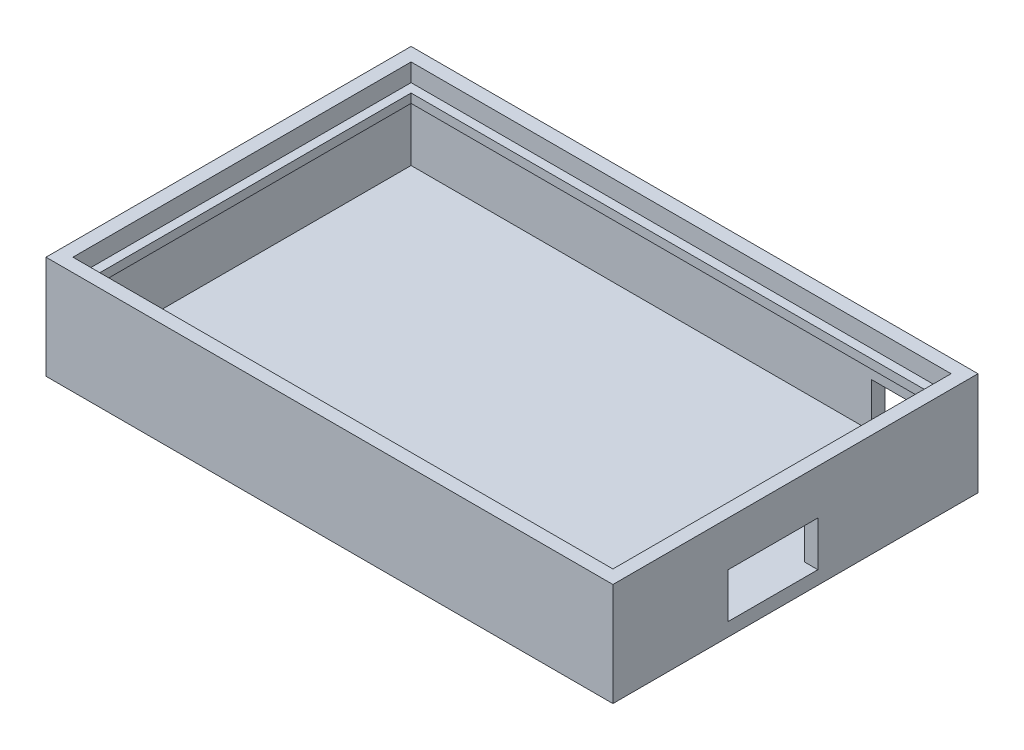
ISO-10303-21;
HEADER;
FILE_DESCRIPTION(('STEP AP214'),'2;1');
FILE_NAME('part.step','',(''),(''),'','','');
FILE_SCHEMA(('AUTOMOTIVE_DESIGN { 1 0 10303 214 1 1 1 1 }'));
ENDSEC;
DATA;
#1=APPLICATION_CONTEXT('core data for automotive mechanical design processes');
#2=APPLICATION_PROTOCOL_DEFINITION('international standard','automotive_design',2000,#1);
#3=PRODUCT_CONTEXT('',#1,'mechanical');
#4=PRODUCT('Part','Part','',(#3));
#5=PRODUCT_RELATED_PRODUCT_CATEGORY('part','',(#4));
#6=PRODUCT_DEFINITION_FORMATION('','',#4);
#7=PRODUCT_DEFINITION_CONTEXT('part definition',#1,'design');
#8=PRODUCT_DEFINITION('design','',#6,#7);
#9=PRODUCT_DEFINITION_SHAPE('','',#8);
#10=(LENGTH_UNIT() NAMED_UNIT(*) SI_UNIT(.MILLI.,.METRE.));
#11=(NAMED_UNIT(*) PLANE_ANGLE_UNIT() SI_UNIT($,.RADIAN.));
#12=(NAMED_UNIT(*) SI_UNIT($,.STERADIAN.) SOLID_ANGLE_UNIT());
#13=UNCERTAINTY_MEASURE_WITH_UNIT(LENGTH_MEASURE(1.E-05),#10,'distance_accuracy_value','');
#14=(GEOMETRIC_REPRESENTATION_CONTEXT(3) GLOBAL_UNCERTAINTY_ASSIGNED_CONTEXT((#13)) GLOBAL_UNIT_ASSIGNED_CONTEXT((#10,
#11,#12)) REPRESENTATION_CONTEXT('',''));
#15=CARTESIAN_POINT('',(0.,0.,0.));
#16=DIRECTION('',(0.,0.,1.));
#17=DIRECTION('',(1.,0.,0.));
#18=AXIS2_PLACEMENT_3D('',#15,#16,#17);
#19=CARTESIAN_POINT('',(-60.2,23.,-37.7));
#20=DIRECTION('',(0.,0.,1.));
#21=DIRECTION('',(1.,0.,0.));
#22=AXIS2_PLACEMENT_3D('',#19,#20,#21);
#23=PLANE('',#22);
#24=DIRECTION('',(0.,-1.,0.));
#25=VECTOR('',#24,1.);
#26=CARTESIAN_POINT('',(60.2,23.,-37.7));
#27=LINE('',#26,#25);
#28=CARTESIAN_POINT('',(60.2,15.,-37.7));
#29=VERTEX_POINT('',#28);
#30=CARTESIAN_POINT('',(60.2,3.,-37.7));
#31=VERTEX_POINT('',#30);
#32=EDGE_CURVE('E349',#29,#31,#27,.T.);
#33=ORIENTED_EDGE('',*,*,#32,.F.);
#34=DIRECTION('',(-1.,0.,0.));
#35=VECTOR('',#34,1.);
#36=CARTESIAN_POINT('',(-60.2,15.,-37.7));
#37=LINE('',#36,#35);
#38=CARTESIAN_POINT('',(-60.2,15.,-37.7));
#39=VERTEX_POINT('',#38);
#40=EDGE_CURVE('E44',#29,#39,#37,.T.);
#41=ORIENTED_EDGE('',*,*,#40,.T.);
#42=DIRECTION('',(0.,-1.,0.));
#43=VECTOR('',#42,1.);
#44=CARTESIAN_POINT('',(-60.2,23.,-37.7));
#45=LINE('',#44,#43);
#46=CARTESIAN_POINT('',(-60.2,3.,-37.7));
#47=VERTEX_POINT('',#46);
#48=EDGE_CURVE('E345',#39,#47,#45,.T.);
#49=ORIENTED_EDGE('',*,*,#48,.T.);
#50=DIRECTION('',(-1.,0.,0.));
#51=VECTOR('',#50,1.);
#52=CARTESIAN_POINT('',(-60.2,3.,-37.7));
#53=LINE('',#52,#51);
#54=CARTESIAN_POINT('',(42.5,3.,-37.7));
#55=VERTEX_POINT('',#54);
#56=EDGE_CURVE('E337',#55,#47,#53,.T.);
#57=ORIENTED_EDGE('',*,*,#56,.F.);
#58=DIRECTION('',(0.,1.,0.));
#59=VECTOR('',#58,1.);
#60=CARTESIAN_POINT('',(42.5,23.,-37.7));
#61=LINE('',#60,#59);
#62=CARTESIAN_POINT('',(42.5,13.,-37.7));
#63=VERTEX_POINT('',#62);
#64=EDGE_CURVE('E273',#55,#63,#61,.T.);
#65=ORIENTED_EDGE('',*,*,#64,.T.);
#66=DIRECTION('',(1.,0.,0.));
#67=VECTOR('',#66,1.);
#68=CARTESIAN_POINT('',(-60.2,13.,-37.7));
#69=LINE('',#68,#67);
#70=CARTESIAN_POINT('',(57.5,13.,-37.7));
#71=VERTEX_POINT('',#70);
#72=EDGE_CURVE('E391',#63,#71,#69,.T.);
#73=ORIENTED_EDGE('',*,*,#72,.T.);
#74=DIRECTION('',(0.,-1.,0.));
#75=VECTOR('',#74,1.);
#76=CARTESIAN_POINT('',(57.5,23.,-37.7));
#77=LINE('',#76,#75);
#78=CARTESIAN_POINT('',(57.5,3.,-37.7));
#79=VERTEX_POINT('',#78);
#80=EDGE_CURVE('E281',#71,#79,#77,.T.);
#81=ORIENTED_EDGE('',*,*,#80,.T.);
#82=EDGE_CURVE('E338',#31,#79,#53,.T.);
#83=ORIENTED_EDGE('',*,*,#82,.F.);
#84=EDGE_LOOP('',(#33,#41,#49,#57,#65,#73,#81,#83));
#85=FACE_BOUND('',#84,.T.);
#86=ADVANCED_FACE('F35',(#85),#23,.T.);
#87=CARTESIAN_POINT('',(60.2,23.,37.7));
#88=DIRECTION('',(-1.,0.,0.));
#89=DIRECTION('',(0.,0.,1.));
#90=AXIS2_PLACEMENT_3D('',#87,#88,#89);
#91=PLANE('',#90);
#92=DIRECTION('',(0.,-1.,0.));
#93=VECTOR('',#92,1.);
#94=CARTESIAN_POINT('',(60.2,23.,37.7));
#95=LINE('',#94,#93);
#96=CARTESIAN_POINT('',(60.2,15.,37.7));
#97=VERTEX_POINT('',#96);
#98=CARTESIAN_POINT('',(60.2,3.,37.7));
#99=VERTEX_POINT('',#98);
#100=EDGE_CURVE('E353',#97,#99,#95,.T.);
#101=ORIENTED_EDGE('',*,*,#100,.F.);
#102=DIRECTION('',(0.,0.,-1.));
#103=VECTOR('',#102,1.);
#104=CARTESIAN_POINT('',(60.2,15.,37.7));
#105=LINE('',#104,#103);
#106=EDGE_CURVE('E59',#97,#29,#105,.T.);
#107=ORIENTED_EDGE('',*,*,#106,.T.);
#108=ORIENTED_EDGE('',*,*,#32,.T.);
#109=DIRECTION('',(0.,0.,-1.));
#110=VECTOR('',#109,1.);
#111=CARTESIAN_POINT('',(60.2,3.,37.7));
#112=LINE('',#111,#110);
#113=CARTESIAN_POINT('',(60.2,3.,-5.));
#114=VERTEX_POINT('',#113);
#115=EDGE_CURVE('E333',#114,#31,#112,.T.);
#116=ORIENTED_EDGE('',*,*,#115,.F.);
#117=DIRECTION('',(0.,1.,0.));
#118=VECTOR('',#117,1.);
#119=CARTESIAN_POINT('',(60.2,23.,-5.));
#120=LINE('',#119,#118);
#121=CARTESIAN_POINT('',(60.2,13.,-5.));
#122=VERTEX_POINT('',#121);
#123=EDGE_CURVE('E316',#114,#122,#120,.T.);
#124=ORIENTED_EDGE('',*,*,#123,.T.);
#125=DIRECTION('',(0.,0.,-1.));
#126=VECTOR('',#125,1.);
#127=CARTESIAN_POINT('',(60.2,13.,37.7));
#128=LINE('',#127,#126);
#129=CARTESIAN_POINT('',(60.2,13.,15.));
#130=VERTEX_POINT('',#129);
#131=EDGE_CURVE('E389',#130,#122,#128,.T.);
#132=ORIENTED_EDGE('',*,*,#131,.F.);
#133=DIRECTION('',(0.,-1.,0.));
#134=VECTOR('',#133,1.);
#135=CARTESIAN_POINT('',(60.2,23.,15.));
#136=LINE('',#135,#134);
#137=CARTESIAN_POINT('',(60.2,3.,15.));
#138=VERTEX_POINT('',#137);
#139=EDGE_CURVE('E313',#130,#138,#136,.T.);
#140=ORIENTED_EDGE('',*,*,#139,.T.);
#141=EDGE_CURVE('E334',#99,#138,#112,.T.);
#142=ORIENTED_EDGE('',*,*,#141,.F.);
#143=EDGE_LOOP('',(#101,#107,#108,#116,#124,#132,#140,#142));
#144=FACE_BOUND('',#143,.T.);
#145=ADVANCED_FACE('F414',(#144),#91,.T.);
#146=CARTESIAN_POINT('',(-60.2,23.,37.7));
#147=DIRECTION('',(0.,0.,-1.));
#148=DIRECTION('',(-1.,0.,0.));
#149=AXIS2_PLACEMENT_3D('',#146,#147,#148);
#150=PLANE('',#149);
#151=DIRECTION('',(0.,-1.,0.));
#152=VECTOR('',#151,1.);
#153=CARTESIAN_POINT('',(-60.2,23.,37.7));
#154=LINE('',#153,#152);
#155=CARTESIAN_POINT('',(-60.2,15.,37.7));
#156=VERTEX_POINT('',#155);
#157=CARTESIAN_POINT('',(-60.2,3.,37.7));
#158=VERTEX_POINT('',#157);
#159=EDGE_CURVE('E330',#156,#158,#154,.T.);
#160=ORIENTED_EDGE('',*,*,#159,.F.);
#161=DIRECTION('',(1.,0.,0.));
#162=VECTOR('',#161,1.);
#163=CARTESIAN_POINT('',(-60.2,15.,37.7));
#164=LINE('',#163,#162);
#165=EDGE_CURVE('E205',#156,#97,#164,.T.);
#166=ORIENTED_EDGE('',*,*,#165,.T.);
#167=ORIENTED_EDGE('',*,*,#100,.T.);
#168=DIRECTION('',(1.,0.,0.));
#169=VECTOR('',#168,1.);
#170=CARTESIAN_POINT('',(-60.2,3.,37.7));
#171=LINE('',#170,#169);
#172=EDGE_CURVE('E319',#158,#99,#171,.T.);
#173=ORIENTED_EDGE('',*,*,#172,.F.);
#174=EDGE_LOOP('',(#160,#166,#167,#173));
#175=FACE_BOUND('',#174,.T.);
#176=ADVANCED_FACE('F409',(#175),#150,.T.);
#177=CARTESIAN_POINT('',(-60.2,23.,37.7));
#178=DIRECTION('',(1.,0.,0.));
#179=DIRECTION('',(0.,0.,-1.));
#180=AXIS2_PLACEMENT_3D('',#177,#178,#179);
#181=PLANE('',#180);
#182=ORIENTED_EDGE('',*,*,#48,.F.);
#183=DIRECTION('',(0.,0.,1.));
#184=VECTOR('',#183,1.);
#185=CARTESIAN_POINT('',(-60.2,15.,37.7));
#186=LINE('',#185,#184);
#187=EDGE_CURVE('E11',#39,#156,#186,.T.);
#188=ORIENTED_EDGE('',*,*,#187,.T.);
#189=ORIENTED_EDGE('',*,*,#159,.T.);
#190=DIRECTION('',(0.,0.,1.));
#191=VECTOR('',#190,1.);
#192=CARTESIAN_POINT('',(-60.2,3.,37.7));
#193=LINE('',#192,#191);
#194=EDGE_CURVE('E323',#47,#158,#193,.T.);
#195=ORIENTED_EDGE('',*,*,#194,.F.);
#196=EDGE_LOOP('',(#182,#188,#189,#195));
#197=FACE_BOUND('',#196,.T.);
#198=ADVANCED_FACE('F405',(#197),#181,.T.);
#199=CARTESIAN_POINT('',(0.,3.,-40.7));
#200=DIRECTION('',(0.,0.,-1.));
#201=DIRECTION('',(-1.,0.,0.));
#202=AXIS2_PLACEMENT_3D('',#199,#200,#201);
#203=PLANE('',#202);
#204=DIRECTION('',(1.,0.,0.));
#205=VECTOR('',#204,1.);
#206=CARTESIAN_POINT('',(0.,0.,-40.7));
#207=LINE('',#206,#205);
#208=CARTESIAN_POINT('',(-63.2,0.,-40.7));
#209=VERTEX_POINT('',#208);
#210=CARTESIAN_POINT('',(63.2,0.,-40.7));
#211=VERTEX_POINT('',#210);
#212=EDGE_CURVE('E377',#209,#211,#207,.T.);
#213=ORIENTED_EDGE('',*,*,#212,.F.);
#214=DIRECTION('',(0.,-1.,0.));
#215=VECTOR('',#214,1.);
#216=CARTESIAN_POINT('',(-63.2,3.,-40.7));
#217=LINE('',#216,#215);
#218=CARTESIAN_POINT('',(-63.2,23.,-40.7));
#219=VERTEX_POINT('',#218);
#220=EDGE_CURVE('E380',#219,#209,#217,.T.);
#221=ORIENTED_EDGE('',*,*,#220,.F.);
#222=DIRECTION('',(-1.,0.,0.));
#223=VECTOR('',#222,1.);
#224=CARTESIAN_POINT('',(-63.2,23.,-40.7));
#225=LINE('',#224,#223);
#226=CARTESIAN_POINT('',(63.2,23.,-40.7));
#227=VERTEX_POINT('',#226);
#228=EDGE_CURVE('E363',#227,#219,#225,.T.);
#229=ORIENTED_EDGE('',*,*,#228,.F.);
#230=DIRECTION('',(0.,-1.,0.));
#231=VECTOR('',#230,1.);
#232=CARTESIAN_POINT('',(63.2,3.,-40.7));
#233=LINE('',#232,#231);
#234=EDGE_CURVE('E382',#227,#211,#233,.T.);
#235=ORIENTED_EDGE('',*,*,#234,.T.);
#236=EDGE_LOOP('',(#213,#221,#229,#235));
#237=FACE_BOUND('',#236,.T.);
#238=DIRECTION('',(0.,1.,0.));
#239=VECTOR('',#238,1.);
#240=CARTESIAN_POINT('',(57.5,3.,-40.7));
#241=LINE('',#240,#239);
#242=CARTESIAN_POINT('',(57.5,3.,-40.7));
#243=VERTEX_POINT('',#242);
#244=CARTESIAN_POINT('',(57.5,13.,-40.7));
#245=VERTEX_POINT('',#244);
#246=EDGE_CURVE('E284',#243,#245,#241,.T.);
#247=ORIENTED_EDGE('',*,*,#246,.T.);
#248=DIRECTION('',(-1.,0.,0.));
#249=VECTOR('',#248,1.);
#250=CARTESIAN_POINT('',(0.,13.,-40.7));
#251=LINE('',#250,#249);
#252=CARTESIAN_POINT('',(42.5,13.,-40.7));
#253=VERTEX_POINT('',#252);
#254=EDGE_CURVE('E289',#245,#253,#251,.T.);
#255=ORIENTED_EDGE('',*,*,#254,.T.);
#256=DIRECTION('',(0.,-1.,0.));
#257=VECTOR('',#256,1.);
#258=CARTESIAN_POINT('',(42.5,3.,-40.7));
#259=LINE('',#258,#257);
#260=CARTESIAN_POINT('',(42.5,3.,-40.7));
#261=VERTEX_POINT('',#260);
#262=EDGE_CURVE('E278',#253,#261,#259,.T.);
#263=ORIENTED_EDGE('',*,*,#262,.T.);
#264=DIRECTION('',(-1.,0.,0.));
#265=VECTOR('',#264,1.);
#266=CARTESIAN_POINT('',(0.,3.,-40.7));
#267=LINE('',#266,#265);
#268=EDGE_CURVE('E287',#243,#261,#267,.T.);
#269=ORIENTED_EDGE('',*,*,#268,.F.);
#270=EDGE_LOOP('',(#247,#255,#263,#269));
#271=FACE_BOUND('',#270,.T.);
#272=ADVANCED_FACE('F442',(#237,#271),#203,.T.);
#273=DIRECTION('',(-1.,0.,0.));
#274=VECTOR('',#273,1.);
#275=CARTESIAN_POINT('',(60.2,19.,-37.7));
#276=LINE('',#275,#274);
#277=CARTESIAN_POINT('',(60.2,19.,-37.7));
#278=VERTEX_POINT('',#277);
#279=CARTESIAN_POINT('',(-60.2,19.,-37.7));
#280=VERTEX_POINT('',#279);
#281=EDGE_CURVE('E259',#278,#280,#276,.T.);
#282=ORIENTED_EDGE('',*,*,#281,.F.);
#283=CARTESIAN_POINT('',(60.2,23.,-37.7));
#284=VERTEX_POINT('',#283);
#285=EDGE_CURVE('E350',#284,#278,#27,.T.);
#286=ORIENTED_EDGE('',*,*,#285,.F.);
#287=DIRECTION('',(-1.,0.,0.));
#288=VECTOR('',#287,1.);
#289=CARTESIAN_POINT('',(-60.2,23.,-37.7));
#290=LINE('',#289,#288);
#291=CARTESIAN_POINT('',(-60.2,23.,-37.7));
#292=VERTEX_POINT('',#291);
#293=EDGE_CURVE('E325',#284,#292,#290,.T.);
#294=ORIENTED_EDGE('',*,*,#293,.T.);
#295=EDGE_CURVE('E346',#292,#280,#45,.T.);
#296=ORIENTED_EDGE('',*,*,#295,.T.);
#297=EDGE_LOOP('',(#282,#286,#294,#296));
#298=FACE_BOUND('',#297,.T.);
#299=ADVANCED_FACE('F460',(#298),#23,.T.);
#300=DIRECTION('',(0.,0.,-1.));
#301=VECTOR('',#300,1.);
#302=CARTESIAN_POINT('',(60.2,19.,37.7));
#303=LINE('',#302,#301);
#304=CARTESIAN_POINT('',(60.2,19.,37.7));
#305=VERTEX_POINT('',#304);
#306=EDGE_CURVE('E256',#305,#278,#303,.T.);
#307=ORIENTED_EDGE('',*,*,#306,.F.);
#308=CARTESIAN_POINT('',(60.2,23.,37.7));
#309=VERTEX_POINT('',#308);
#310=EDGE_CURVE('E354',#309,#305,#95,.T.);
#311=ORIENTED_EDGE('',*,*,#310,.F.);
#312=DIRECTION('',(0.,0.,-1.));
#313=VECTOR('',#312,1.);
#314=CARTESIAN_POINT('',(60.2,23.,37.7));
#315=LINE('',#314,#313);
#316=EDGE_CURVE('E322',#309,#284,#315,.T.);
#317=ORIENTED_EDGE('',*,*,#316,.T.);
#318=ORIENTED_EDGE('',*,*,#285,.T.);
#319=EDGE_LOOP('',(#307,#311,#317,#318));
#320=FACE_BOUND('',#319,.T.);
#321=ADVANCED_FACE('F466',(#320),#91,.T.);
#322=CARTESIAN_POINT('',(-63.2,3.,0.));
#323=DIRECTION('',(-1.,0.,0.));
#324=DIRECTION('',(0.,0.,1.));
#325=AXIS2_PLACEMENT_3D('',#322,#323,#324);
#326=PLANE('',#325);
#327=DIRECTION('',(0.,0.,-1.));
#328=VECTOR('',#327,1.);
#329=CARTESIAN_POINT('',(-63.2,0.,0.));
#330=LINE('',#329,#328);
#331=CARTESIAN_POINT('',(-63.2,0.,40.7));
#332=VERTEX_POINT('',#331);
#333=EDGE_CURVE('E369',#332,#209,#330,.T.);
#334=ORIENTED_EDGE('',*,*,#333,.F.);
#335=DIRECTION('',(0.,-1.,0.));
#336=VECTOR('',#335,1.);
#337=CARTESIAN_POINT('',(-63.2,3.,40.7));
#338=LINE('',#337,#336);
#339=CARTESIAN_POINT('',(-63.2,23.,40.7));
#340=VERTEX_POINT('',#339);
#341=EDGE_CURVE('E387',#340,#332,#338,.T.);
#342=ORIENTED_EDGE('',*,*,#341,.F.);
#343=DIRECTION('',(0.,0.,1.));
#344=VECTOR('',#343,1.);
#345=CARTESIAN_POINT('',(-63.2,23.,40.7));
#346=LINE('',#345,#344);
#347=EDGE_CURVE('E366',#219,#340,#346,.T.);
#348=ORIENTED_EDGE('',*,*,#347,.F.);
#349=ORIENTED_EDGE('',*,*,#220,.T.);
#350=EDGE_LOOP('',(#334,#342,#348,#349));
#351=FACE_BOUND('',#350,.T.);
#352=ADVANCED_FACE('F474',(#351),#326,.T.);
#353=CARTESIAN_POINT('',(0.,3.,40.7));
#354=DIRECTION('',(0.,0.,-1.));
#355=DIRECTION('',(-1.,0.,0.));
#356=AXIS2_PLACEMENT_3D('',#353,#354,#355);
#357=PLANE('',#356);
#358=DIRECTION('',(1.,0.,0.));
#359=VECTOR('',#358,1.);
#360=CARTESIAN_POINT('',(0.,0.,40.7));
#361=LINE('',#360,#359);
#362=CARTESIAN_POINT('',(63.2,0.,40.7));
#363=VERTEX_POINT('',#362);
#364=EDGE_CURVE('E372',#332,#363,#361,.T.);
#365=ORIENTED_EDGE('',*,*,#364,.T.);
#366=DIRECTION('',(0.,-1.,0.));
#367=VECTOR('',#366,1.);
#368=CARTESIAN_POINT('',(63.2,3.,40.7));
#369=LINE('',#368,#367);
#370=CARTESIAN_POINT('',(63.2,23.,40.7));
#371=VERTEX_POINT('',#370);
#372=EDGE_CURVE('E384',#371,#363,#369,.T.);
#373=ORIENTED_EDGE('',*,*,#372,.F.);
#374=DIRECTION('',(1.,0.,0.));
#375=VECTOR('',#374,1.);
#376=CARTESIAN_POINT('',(-63.2,23.,40.7));
#377=LINE('',#376,#375);
#378=EDGE_CURVE('E357',#340,#371,#377,.T.);
#379=ORIENTED_EDGE('',*,*,#378,.F.);
#380=ORIENTED_EDGE('',*,*,#341,.T.);
#381=EDGE_LOOP('',(#365,#373,#379,#380));
#382=FACE_BOUND('',#381,.T.);
#383=ADVANCED_FACE('F519',(#382),#357,.F.);
#384=CARTESIAN_POINT('',(63.2,3.,0.));
#385=DIRECTION('',(-1.,0.,0.));
#386=DIRECTION('',(0.,0.,1.));
#387=AXIS2_PLACEMENT_3D('',#384,#385,#386);
#388=PLANE('',#387);
#389=DIRECTION('',(0.,-1.,0.));
#390=VECTOR('',#389,1.);
#391=CARTESIAN_POINT('',(63.2,13.,15.));
#392=LINE('',#391,#390);
#393=CARTESIAN_POINT('',(63.2,13.,15.));
#394=VERTEX_POINT('',#393);
#395=CARTESIAN_POINT('',(63.2,3.,15.));
#396=VERTEX_POINT('',#395);
#397=EDGE_CURVE('E302',#394,#396,#392,.T.);
#398=ORIENTED_EDGE('',*,*,#397,.F.);
#399=DIRECTION('',(0.,0.,-1.));
#400=VECTOR('',#399,1.);
#401=CARTESIAN_POINT('',(63.2,13.,15.));
#402=LINE('',#401,#400);
#403=CARTESIAN_POINT('',(63.2,13.,-5.));
#404=VERTEX_POINT('',#403);
#405=EDGE_CURVE('E293',#394,#404,#402,.T.);
#406=ORIENTED_EDGE('',*,*,#405,.T.);
#407=DIRECTION('',(0.,-1.,0.));
#408=VECTOR('',#407,1.);
#409=CARTESIAN_POINT('',(63.2,13.,-5.));
#410=LINE('',#409,#408);
#411=CARTESIAN_POINT('',(63.2,3.,-5.));
#412=VERTEX_POINT('',#411);
#413=EDGE_CURVE('E310',#404,#412,#410,.T.);
#414=ORIENTED_EDGE('',*,*,#413,.T.);
#415=DIRECTION('',(0.,0.,-1.));
#416=VECTOR('',#415,1.);
#417=CARTESIAN_POINT('',(63.2,3.,15.));
#418=LINE('',#417,#416);
#419=EDGE_CURVE('E292',#396,#412,#418,.T.);
#420=ORIENTED_EDGE('',*,*,#419,.F.);
#421=EDGE_LOOP('',(#398,#406,#414,#420));
#422=FACE_BOUND('',#421,.T.);
#423=DIRECTION('',(0.,0.,-1.));
#424=VECTOR('',#423,1.);
#425=CARTESIAN_POINT('',(63.2,0.,0.));
#426=LINE('',#425,#424);
#427=EDGE_CURVE('E374',#363,#211,#426,.T.);
#428=ORIENTED_EDGE('',*,*,#427,.T.);
#429=ORIENTED_EDGE('',*,*,#234,.F.);
#430=DIRECTION('',(0.,0.,-1.));
#431=VECTOR('',#430,1.);
#432=CARTESIAN_POINT('',(63.2,23.,40.7));
#433=LINE('',#432,#431);
#434=EDGE_CURVE('E360',#371,#227,#433,.T.);
#435=ORIENTED_EDGE('',*,*,#434,.F.);
#436=ORIENTED_EDGE('',*,*,#372,.T.);
#437=EDGE_LOOP('',(#428,#429,#435,#436));
#438=FACE_BOUND('',#437,.T.);
#439=ADVANCED_FACE('F426',(#422,#438),#388,.F.);
#440=CARTESIAN_POINT('',(0.,0.,0.));
#441=DIRECTION('',(0.,1.,0.));
#442=DIRECTION('',(0.,0.,1.));
#443=AXIS2_PLACEMENT_3D('',#440,#441,#442);
#444=PLANE('',#443);
#445=ORIENTED_EDGE('',*,*,#333,.T.);
#446=ORIENTED_EDGE('',*,*,#212,.T.);
#447=ORIENTED_EDGE('',*,*,#427,.F.);
#448=ORIENTED_EDGE('',*,*,#364,.F.);
#449=EDGE_LOOP('',(#445,#446,#447,#448));
#450=FACE_BOUND('',#449,.T.);
#451=ADVANCED_FACE('F511',(#450),#444,.F.);
#452=CARTESIAN_POINT('',(0.,23.,0.));
#453=DIRECTION('',(0.,1.,0.));
#454=DIRECTION('',(0.,0.,1.));
#455=AXIS2_PLACEMENT_3D('',#452,#453,#454);
#456=PLANE('',#455);
#457=ORIENTED_EDGE('',*,*,#378,.T.);
#458=ORIENTED_EDGE('',*,*,#434,.T.);
#459=ORIENTED_EDGE('',*,*,#228,.T.);
#460=ORIENTED_EDGE('',*,*,#347,.T.);
#461=EDGE_LOOP('',(#457,#458,#459,#460));
#462=FACE_BOUND('',#461,.T.);
#463=ORIENTED_EDGE('',*,*,#316,.F.);
#464=DIRECTION('',(1.,0.,0.));
#465=VECTOR('',#464,1.);
#466=CARTESIAN_POINT('',(-60.2,23.,37.7));
#467=LINE('',#466,#465);
#468=CARTESIAN_POINT('',(-60.2,23.,37.7));
#469=VERTEX_POINT('',#468);
#470=EDGE_CURVE('E320',#469,#309,#467,.T.);
#471=ORIENTED_EDGE('',*,*,#470,.F.);
#472=DIRECTION('',(0.,0.,1.));
#473=VECTOR('',#472,1.);
#474=CARTESIAN_POINT('',(-60.2,23.,37.7));
#475=LINE('',#474,#473);
#476=EDGE_CURVE('E328',#292,#469,#475,.T.);
#477=ORIENTED_EDGE('',*,*,#476,.F.);
#478=ORIENTED_EDGE('',*,*,#293,.F.);
#479=EDGE_LOOP('',(#463,#471,#477,#478));
#480=FACE_BOUND('',#479,.T.);
#481=ADVANCED_FACE('F490',(#462,#480),#456,.T.);
#482=DIRECTION('',(1.,0.,0.));
#483=VECTOR('',#482,1.);
#484=CARTESIAN_POINT('',(-60.2,19.,37.7));
#485=LINE('',#484,#483);
#486=CARTESIAN_POINT('',(-60.2,19.,37.7));
#487=VERTEX_POINT('',#486);
#488=EDGE_CURVE('E250',#487,#305,#485,.T.);
#489=ORIENTED_EDGE('',*,*,#488,.F.);
#490=EDGE_CURVE('E343',#469,#487,#154,.T.);
#491=ORIENTED_EDGE('',*,*,#490,.F.);
#492=ORIENTED_EDGE('',*,*,#470,.T.);
#493=ORIENTED_EDGE('',*,*,#310,.T.);
#494=EDGE_LOOP('',(#489,#491,#492,#493));
#495=FACE_BOUND('',#494,.T.);
#496=ADVANCED_FACE('F487',(#495),#150,.T.);
#497=DIRECTION('',(0.,0.,1.));
#498=VECTOR('',#497,1.);
#499=CARTESIAN_POINT('',(-60.2,19.,-37.7));
#500=LINE('',#499,#498);
#501=EDGE_CURVE('E262',#280,#487,#500,.T.);
#502=ORIENTED_EDGE('',*,*,#501,.F.);
#503=ORIENTED_EDGE('',*,*,#295,.F.);
#504=ORIENTED_EDGE('',*,*,#476,.T.);
#505=ORIENTED_EDGE('',*,*,#490,.T.);
#506=EDGE_LOOP('',(#502,#503,#504,#505));
#507=FACE_BOUND('',#506,.T.);
#508=ADVANCED_FACE('F493',(#507),#181,.T.);
#509=CARTESIAN_POINT('',(0.,3.,0.));
#510=DIRECTION('',(0.,1.,0.));
#511=DIRECTION('',(0.,0.,1.));
#512=AXIS2_PLACEMENT_3D('',#509,#510,#511);
#513=PLANE('',#512);
#514=ORIENTED_EDGE('',*,*,#82,.T.);
#515=DIRECTION('',(0.,0.,-1.));
#516=VECTOR('',#515,1.);
#517=CARTESIAN_POINT('',(57.5,3.,-31.332573725344));
#518=LINE('',#517,#516);
#519=EDGE_CURVE('E265',#79,#243,#518,.T.);
#520=ORIENTED_EDGE('',*,*,#519,.T.);
#521=ORIENTED_EDGE('',*,*,#268,.T.);
#522=DIRECTION('',(0.,0.,1.));
#523=VECTOR('',#522,1.);
#524=CARTESIAN_POINT('',(42.5,3.,-31.332573725344));
#525=LINE('',#524,#523);
#526=EDGE_CURVE('E270',#261,#55,#525,.T.);
#527=ORIENTED_EDGE('',*,*,#526,.T.);
#528=ORIENTED_EDGE('',*,*,#56,.T.);
#529=ORIENTED_EDGE('',*,*,#194,.T.);
#530=ORIENTED_EDGE('',*,*,#172,.T.);
#531=ORIENTED_EDGE('',*,*,#141,.T.);
#532=DIRECTION('',(1.,0.,0.));
#533=VECTOR('',#532,1.);
#534=CARTESIAN_POINT('',(63.2,3.,15.));
#535=LINE('',#534,#533);
#536=EDGE_CURVE('E297',#138,#396,#535,.T.);
#537=ORIENTED_EDGE('',*,*,#536,.T.);
#538=ORIENTED_EDGE('',*,*,#419,.T.);
#539=DIRECTION('',(-1.,0.,0.));
#540=VECTOR('',#539,1.);
#541=CARTESIAN_POINT('',(63.2,3.,-5.));
#542=LINE('',#541,#540);
#543=EDGE_CURVE('E305',#412,#114,#542,.T.);
#544=ORIENTED_EDGE('',*,*,#543,.T.);
#545=ORIENTED_EDGE('',*,*,#115,.T.);
#546=EDGE_LOOP('',(#514,#520,#521,#527,#528,#529,#530,#531,#537,#538,#544,#545));
#547=FACE_BOUND('',#546,.T.);
#548=ADVANCED_FACE('F412',(#547),#513,.T.);
#549=CARTESIAN_POINT('',(63.2,13.,-5.));
#550=DIRECTION('',(0.,0.,1.));
#551=DIRECTION('',(1.,0.,0.));
#552=AXIS2_PLACEMENT_3D('',#549,#550,#551);
#553=PLANE('',#552);
#554=ORIENTED_EDGE('',*,*,#543,.F.);
#555=ORIENTED_EDGE('',*,*,#413,.F.);
#556=DIRECTION('',(-1.,0.,0.));
#557=VECTOR('',#556,1.);
#558=CARTESIAN_POINT('',(63.2,13.,-5.));
#559=LINE('',#558,#557);
#560=EDGE_CURVE('E296',#404,#122,#559,.T.);
#561=ORIENTED_EDGE('',*,*,#560,.T.);
#562=ORIENTED_EDGE('',*,*,#123,.F.);
#563=EDGE_LOOP('',(#554,#555,#561,#562));
#564=FACE_BOUND('',#563,.T.);
#565=ADVANCED_FACE('F431',(#564),#553,.T.);
#566=CARTESIAN_POINT('',(63.2,13.,15.));
#567=DIRECTION('',(0.,0.,-1.));
#568=DIRECTION('',(-1.,0.,0.));
#569=AXIS2_PLACEMENT_3D('',#566,#567,#568);
#570=PLANE('',#569);
#571=DIRECTION('',(1.,0.,0.));
#572=VECTOR('',#571,1.);
#573=CARTESIAN_POINT('',(63.2,13.,15.));
#574=LINE('',#573,#572);
#575=EDGE_CURVE('E300',#130,#394,#574,.T.);
#576=ORIENTED_EDGE('',*,*,#575,.T.);
#577=ORIENTED_EDGE('',*,*,#397,.T.);
#578=ORIENTED_EDGE('',*,*,#536,.F.);
#579=ORIENTED_EDGE('',*,*,#139,.F.);
#580=EDGE_LOOP('',(#576,#577,#578,#579));
#581=FACE_BOUND('',#580,.T.);
#582=ADVANCED_FACE('F418',(#581),#570,.T.);
#583=CARTESIAN_POINT('',(0.,13.,0.));
#584=DIRECTION('',(0.,1.,0.));
#585=DIRECTION('',(0.,0.,1.));
#586=AXIS2_PLACEMENT_3D('',#583,#584,#585);
#587=PLANE('',#586);
#588=ORIENTED_EDGE('',*,*,#131,.T.);
#589=ORIENTED_EDGE('',*,*,#560,.F.);
#590=ORIENTED_EDGE('',*,*,#405,.F.);
#591=ORIENTED_EDGE('',*,*,#575,.F.);
#592=EDGE_LOOP('',(#588,#589,#590,#591));
#593=FACE_BOUND('',#592,.T.);
#594=ADVANCED_FACE('F421',(#593),#587,.F.);
#595=CARTESIAN_POINT('',(57.5,13.,-31.332573725344));
#596=DIRECTION('',(-1.,0.,0.));
#597=DIRECTION('',(0.,0.,1.));
#598=AXIS2_PLACEMENT_3D('',#595,#596,#597);
#599=PLANE('',#598);
#600=ORIENTED_EDGE('',*,*,#519,.F.);
#601=ORIENTED_EDGE('',*,*,#80,.F.);
#602=DIRECTION('',(0.,0.,-1.));
#603=VECTOR('',#602,1.);
#604=CARTESIAN_POINT('',(57.5,13.,-31.332573725344));
#605=LINE('',#604,#603);
#606=EDGE_CURVE('E266',#71,#245,#605,.T.);
#607=ORIENTED_EDGE('',*,*,#606,.T.);
#608=ORIENTED_EDGE('',*,*,#246,.F.);
#609=EDGE_LOOP('',(#600,#601,#607,#608));
#610=FACE_BOUND('',#609,.T.);
#611=ADVANCED_FACE('F436',(#610),#599,.T.);
#612=CARTESIAN_POINT('',(42.5,13.,-31.332573725344));
#613=DIRECTION('',(1.,0.,0.));
#614=DIRECTION('',(0.,0.,-1.));
#615=AXIS2_PLACEMENT_3D('',#612,#613,#614);
#616=PLANE('',#615);
#617=DIRECTION('',(0.,0.,1.));
#618=VECTOR('',#617,1.);
#619=CARTESIAN_POINT('',(42.5,13.,-31.332573725344));
#620=LINE('',#619,#618);
#621=EDGE_CURVE('E269',#253,#63,#620,.T.);
#622=ORIENTED_EDGE('',*,*,#621,.T.);
#623=ORIENTED_EDGE('',*,*,#64,.F.);
#624=ORIENTED_EDGE('',*,*,#526,.F.);
#625=ORIENTED_EDGE('',*,*,#262,.F.);
#626=EDGE_LOOP('',(#622,#623,#624,#625));
#627=FACE_BOUND('',#626,.T.);
#628=ADVANCED_FACE('F447',(#627),#616,.T.);
#629=CARTESIAN_POINT('',(0.,13.,0.));
#630=DIRECTION('',(0.,-1.,0.));
#631=DIRECTION('',(0.,0.,-1.));
#632=AXIS2_PLACEMENT_3D('',#629,#630,#631);
#633=PLANE('',#632);
#634=ORIENTED_EDGE('',*,*,#606,.F.);
#635=ORIENTED_EDGE('',*,*,#72,.F.);
#636=ORIENTED_EDGE('',*,*,#621,.F.);
#637=ORIENTED_EDGE('',*,*,#254,.F.);
#638=EDGE_LOOP('',(#634,#635,#636,#637));
#639=FACE_BOUND('',#638,.T.);
#640=ADVANCED_FACE('F439',(#639),#633,.T.);
#641=CARTESIAN_POINT('',(0.,19.,0.));
#642=DIRECTION('',(0.,1.,0.));
#643=DIRECTION('',(0.,0.,1.));
#644=AXIS2_PLACEMENT_3D('',#641,#642,#643);
#645=PLANE('',#644);
#646=DIRECTION('',(0.,0.,1.));
#647=VECTOR('',#646,1.);
#648=CARTESIAN_POINT('',(-58.2,19.,-35.7));
#649=LINE('',#648,#647);
#650=CARTESIAN_POINT('',(-58.2,19.,-35.7));
#651=VERTEX_POINT('',#650);
#652=CARTESIAN_POINT('',(-58.2,19.,35.7));
#653=VERTEX_POINT('',#652);
#654=EDGE_CURVE('E225',#651,#653,#649,.T.);
#655=ORIENTED_EDGE('',*,*,#654,.F.);
#656=DIRECTION('',(-1.,0.,0.));
#657=VECTOR('',#656,1.);
#658=CARTESIAN_POINT('',(58.2,19.,-35.7));
#659=LINE('',#658,#657);
#660=CARTESIAN_POINT('',(58.2,19.,-35.7));
#661=VERTEX_POINT('',#660);
#662=EDGE_CURVE('E219',#661,#651,#659,.T.);
#663=ORIENTED_EDGE('',*,*,#662,.F.);
#664=DIRECTION('',(0.,0.,-1.));
#665=VECTOR('',#664,1.);
#666=CARTESIAN_POINT('',(58.2,19.,35.7));
#667=LINE('',#666,#665);
#668=CARTESIAN_POINT('',(58.2,19.,35.7));
#669=VERTEX_POINT('',#668);
#670=EDGE_CURVE('E243',#669,#661,#667,.T.);
#671=ORIENTED_EDGE('',*,*,#670,.F.);
#672=DIRECTION('',(1.,0.,0.));
#673=VECTOR('',#672,1.);
#674=CARTESIAN_POINT('',(-58.2,19.,35.7));
#675=LINE('',#674,#673);
#676=EDGE_CURVE('E241',#653,#669,#675,.T.);
#677=ORIENTED_EDGE('',*,*,#676,.F.);
#678=EDGE_LOOP('',(#655,#663,#671,#677));
#679=FACE_BOUND('',#678,.T.);
#680=ORIENTED_EDGE('',*,*,#488,.T.);
#681=ORIENTED_EDGE('',*,*,#306,.T.);
#682=ORIENTED_EDGE('',*,*,#281,.T.);
#683=ORIENTED_EDGE('',*,*,#501,.T.);
#684=EDGE_LOOP('',(#680,#681,#682,#683));
#685=FACE_BOUND('',#684,.T.);
#686=ADVANCED_FACE('F455',(#679,#685),#645,.T.);
#687=CARTESIAN_POINT('',(-58.2,17.,-35.7));
#688=DIRECTION('',(-1.,0.,0.));
#689=DIRECTION('',(0.,0.,1.));
#690=AXIS2_PLACEMENT_3D('',#687,#688,#689);
#691=PLANE('',#690);
#692=ORIENTED_EDGE('',*,*,#654,.T.);
#693=DIRECTION('',(0.,1.,0.));
#694=VECTOR('',#693,1.);
#695=CARTESIAN_POINT('',(-58.2,17.,35.7));
#696=LINE('',#695,#694);
#697=CARTESIAN_POINT('',(-58.2,17.,35.7));
#698=VERTEX_POINT('',#697);
#699=EDGE_CURVE('E222',#698,#653,#696,.T.);
#700=ORIENTED_EDGE('',*,*,#699,.F.);
#701=DIRECTION('',(0.,0.,1.));
#702=VECTOR('',#701,1.);
#703=CARTESIAN_POINT('',(-58.2,17.,-35.7));
#704=LINE('',#703,#702);
#705=CARTESIAN_POINT('',(-58.2,17.,-35.7));
#706=VERTEX_POINT('',#705);
#707=EDGE_CURVE('E213',#706,#698,#704,.T.);
#708=ORIENTED_EDGE('',*,*,#707,.F.);
#709=DIRECTION('',(0.,1.,0.));
#710=VECTOR('',#709,1.);
#711=CARTESIAN_POINT('',(-58.2,17.,-35.7));
#712=LINE('',#711,#710);
#713=EDGE_CURVE('E248',#706,#651,#712,.T.);
#714=ORIENTED_EDGE('',*,*,#713,.T.);
#715=EDGE_LOOP('',(#692,#700,#708,#714));
#716=FACE_BOUND('',#715,.T.);
#717=ADVANCED_FACE('F223',(#716),#691,.F.);
#718=CARTESIAN_POINT('',(58.2,17.,-35.7));
#719=DIRECTION('',(0.,0.,-1.));
#720=DIRECTION('',(-1.,0.,0.));
#721=AXIS2_PLACEMENT_3D('',#718,#719,#720);
#722=PLANE('',#721);
#723=ORIENTED_EDGE('',*,*,#662,.T.);
#724=ORIENTED_EDGE('',*,*,#713,.F.);
#725=DIRECTION('',(-1.,0.,0.));
#726=VECTOR('',#725,1.);
#727=CARTESIAN_POINT('',(58.2,17.,-35.7));
#728=LINE('',#727,#726);
#729=CARTESIAN_POINT('',(58.2,17.,-35.7));
#730=VERTEX_POINT('',#729);
#731=EDGE_CURVE('E230',#730,#706,#728,.T.);
#732=ORIENTED_EDGE('',*,*,#731,.F.);
#733=DIRECTION('',(0.,1.,0.));
#734=VECTOR('',#733,1.);
#735=CARTESIAN_POINT('',(58.2,17.,-35.7));
#736=LINE('',#735,#734);
#737=EDGE_CURVE('E251',#730,#661,#736,.T.);
#738=ORIENTED_EDGE('',*,*,#737,.T.);
#739=EDGE_LOOP('',(#723,#724,#732,#738));
#740=FACE_BOUND('',#739,.T.);
#741=ADVANCED_FACE('F541',(#740),#722,.F.);
#742=CARTESIAN_POINT('',(58.2,17.,35.7));
#743=DIRECTION('',(1.,0.,0.));
#744=DIRECTION('',(0.,0.,-1.));
#745=AXIS2_PLACEMENT_3D('',#742,#743,#744);
#746=PLANE('',#745);
#747=ORIENTED_EDGE('',*,*,#670,.T.);
#748=ORIENTED_EDGE('',*,*,#737,.F.);
#749=DIRECTION('',(0.,0.,-1.));
#750=VECTOR('',#749,1.);
#751=CARTESIAN_POINT('',(58.2,17.,35.7));
#752=LINE('',#751,#750);
#753=CARTESIAN_POINT('',(58.2,17.,35.7));
#754=VERTEX_POINT('',#753);
#755=EDGE_CURVE('E234',#754,#730,#752,.T.);
#756=ORIENTED_EDGE('',*,*,#755,.F.);
#757=DIRECTION('',(0.,1.,0.));
#758=VECTOR('',#757,1.);
#759=CARTESIAN_POINT('',(58.2,17.,35.7));
#760=LINE('',#759,#758);
#761=EDGE_CURVE('E229',#754,#669,#760,.T.);
#762=ORIENTED_EDGE('',*,*,#761,.T.);
#763=EDGE_LOOP('',(#747,#748,#756,#762));
#764=FACE_BOUND('',#763,.T.);
#765=ADVANCED_FACE('F536',(#764),#746,.F.);
#766=CARTESIAN_POINT('',(-58.2,17.,35.7));
#767=DIRECTION('',(0.,0.,1.));
#768=DIRECTION('',(1.,0.,0.));
#769=AXIS2_PLACEMENT_3D('',#766,#767,#768);
#770=PLANE('',#769);
#771=ORIENTED_EDGE('',*,*,#676,.T.);
#772=ORIENTED_EDGE('',*,*,#761,.F.);
#773=DIRECTION('',(1.,0.,0.));
#774=VECTOR('',#773,1.);
#775=CARTESIAN_POINT('',(-58.2,17.,35.7));
#776=LINE('',#775,#774);
#777=EDGE_CURVE('E202',#698,#754,#776,.T.);
#778=ORIENTED_EDGE('',*,*,#777,.F.);
#779=ORIENTED_EDGE('',*,*,#699,.T.);
#780=EDGE_LOOP('',(#771,#772,#778,#779));
#781=FACE_BOUND('',#780,.T.);
#782=ADVANCED_FACE('F233',(#781),#770,.F.);
#783=CARTESIAN_POINT('',(-60.2,15.,-37.7));
#784=DIRECTION('',(0.,0.707106781186542,-0.707106781186552));
#785=DIRECTION('',(-1.,0.,0.));
#786=AXIS2_PLACEMENT_3D('',#783,#784,#785);
#787=PLANE('',#786);
#788=DIRECTION('',(-0.577350269189623,0.577350269189631,0.577350269189623));
#789=VECTOR('',#788,1.);
#790=CARTESIAN_POINT('',(35.0666666666669,40.1333333333334,-12.5666666666669));
#791=LINE('',#790,#789);
#792=EDGE_CURVE('E208',#730,#29,#791,.F.);
#793=ORIENTED_EDGE('',*,*,#792,.F.);
#794=ORIENTED_EDGE('',*,*,#731,.T.);
#795=DIRECTION('',(0.577350269189623,0.577350269189631,0.577350269189623));
#796=VECTOR('',#795,1.);
#797=CARTESIAN_POINT('',(-60.2,15.,-37.7));
#798=LINE('',#797,#796);
#799=EDGE_CURVE('E39',#39,#706,#798,.T.);
#800=ORIENTED_EDGE('',*,*,#799,.F.);
#801=ORIENTED_EDGE('',*,*,#40,.F.);
#802=EDGE_LOOP('',(#793,#794,#800,#801));
#803=FACE_BOUND('',#802,.T.);
#804=ADVANCED_FACE('F37',(#803),#787,.F.);
#805=CARTESIAN_POINT('',(-60.2,15.,37.7));
#806=DIRECTION('',(-0.707106781186552,0.707106781186542,0.));
#807=DIRECTION('',(0.,0.,1.));
#808=AXIS2_PLACEMENT_3D('',#805,#806,#807);
#809=PLANE('',#808);
#810=ORIENTED_EDGE('',*,*,#799,.T.);
#811=ORIENTED_EDGE('',*,*,#707,.T.);
#812=DIRECTION('',(-0.577350269189623,-0.577350269189631,0.577350269189623));
#813=VECTOR('',#812,1.);
#814=CARTESIAN_POINT('',(-60.2,15.,37.7));
#815=LINE('',#814,#813);
#816=EDGE_CURVE('E198',#156,#698,#815,.F.);
#817=ORIENTED_EDGE('',*,*,#816,.F.);
#818=ORIENTED_EDGE('',*,*,#187,.F.);
#819=EDGE_LOOP('',(#810,#811,#817,#818));
#820=FACE_BOUND('',#819,.T.);
#821=ADVANCED_FACE('F215',(#820),#809,.F.);
#822=CARTESIAN_POINT('',(60.2,15.,37.7));
#823=DIRECTION('',(0.707106781186552,0.707106781186542,0.));
#824=DIRECTION('',(0.,0.,-1.));
#825=AXIS2_PLACEMENT_3D('',#822,#823,#824);
#826=PLANE('',#825);
#827=ORIENTED_EDGE('',*,*,#792,.T.);
#828=ORIENTED_EDGE('',*,*,#106,.F.);
#829=DIRECTION('',(-0.577350269189623,0.577350269189631,-0.577350269189623));
#830=VECTOR('',#829,1.);
#831=CARTESIAN_POINT('',(20.066666666667,55.1333333333335,-2.43333333333297));
#832=LINE('',#831,#830);
#833=EDGE_CURVE('E209',#754,#97,#832,.F.);
#834=ORIENTED_EDGE('',*,*,#833,.F.);
#835=ORIENTED_EDGE('',*,*,#755,.T.);
#836=EDGE_LOOP('',(#827,#828,#834,#835));
#837=FACE_BOUND('',#836,.T.);
#838=ADVANCED_FACE('F400',(#837),#826,.F.);
#839=CARTESIAN_POINT('',(-60.2,15.,37.7));
#840=DIRECTION('',(0.,0.707106781186542,0.707106781186552));
#841=DIRECTION('',(1.,0.,0.));
#842=AXIS2_PLACEMENT_3D('',#839,#840,#841);
#843=PLANE('',#842);
#844=ORIENTED_EDGE('',*,*,#816,.T.);
#845=ORIENTED_EDGE('',*,*,#777,.T.);
#846=ORIENTED_EDGE('',*,*,#833,.T.);
#847=ORIENTED_EDGE('',*,*,#165,.F.);
#848=EDGE_LOOP('',(#844,#845,#846,#847));
#849=FACE_BOUND('',#848,.T.);
#850=ADVANCED_FACE('F200',(#849),#843,.F.);
#851=CLOSED_SHELL('',(#86,#145,#176,#198,#272,#299,#321,#352,#383,#439,#451,#481,#496,#508,#548,
#565,#582,#594,#611,#628,#640,#686,#717,#741,#765,#782,#804,#821,#838,#850));
#852=MANIFOLD_SOLID_BREP('B2',#851);
#853=ADVANCED_BREP_SHAPE_REPRESENTATION('',(#18,#852),#14);
#854=SHAPE_DEFINITION_REPRESENTATION(#9,#853);
ENDSEC;
END-ISO-10303-21;
